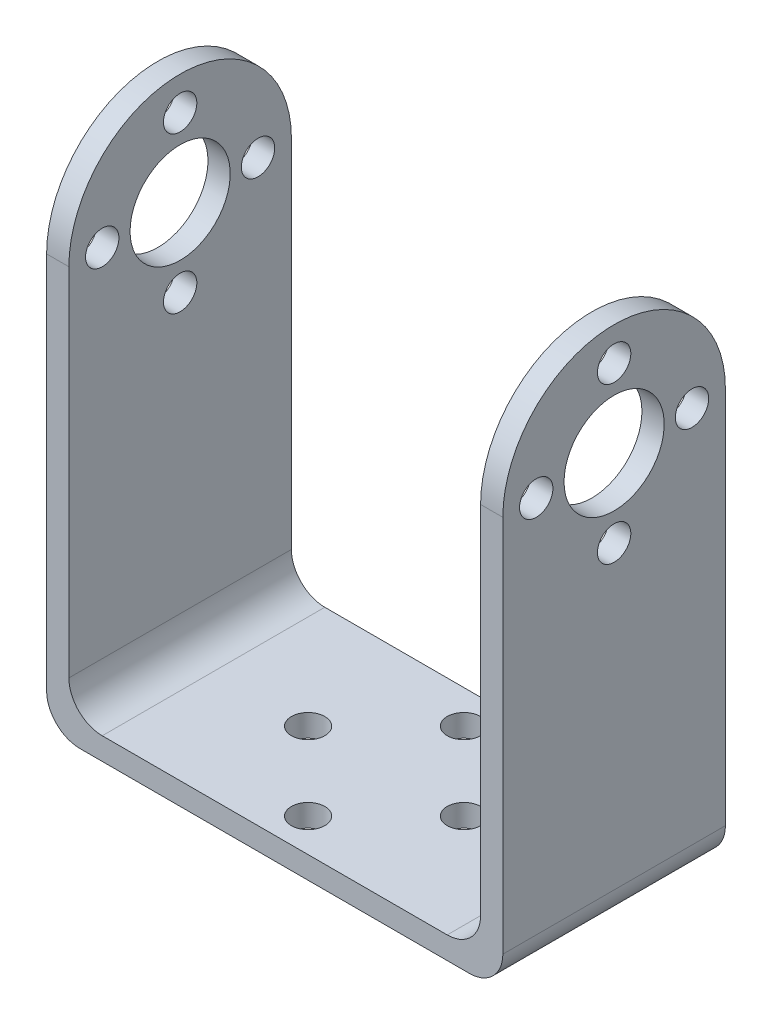
ISO-10303-21;
HEADER;
FILE_DESCRIPTION(('STEP AP214'),'2;1');
FILE_NAME('part.step','',(''),(''),'','','');
FILE_SCHEMA(('AUTOMOTIVE_DESIGN { 1 0 10303 214 1 1 1 1 }'));
ENDSEC;
DATA;
#1=APPLICATION_CONTEXT('core data for automotive mechanical design processes');
#2=APPLICATION_PROTOCOL_DEFINITION('international standard','automotive_design',2000,#1);
#3=PRODUCT_CONTEXT('',#1,'mechanical');
#4=PRODUCT('Part','Part','',(#3));
#5=PRODUCT_RELATED_PRODUCT_CATEGORY('part','',(#4));
#6=PRODUCT_DEFINITION_FORMATION('','',#4);
#7=PRODUCT_DEFINITION_CONTEXT('part definition',#1,'design');
#8=PRODUCT_DEFINITION('design','',#6,#7);
#9=PRODUCT_DEFINITION_SHAPE('','',#8);
#10=(LENGTH_UNIT() NAMED_UNIT(*) SI_UNIT(.MILLI.,.METRE.));
#11=(NAMED_UNIT(*) PLANE_ANGLE_UNIT() SI_UNIT($,.RADIAN.));
#12=(NAMED_UNIT(*) SI_UNIT($,.STERADIAN.) SOLID_ANGLE_UNIT());
#13=UNCERTAINTY_MEASURE_WITH_UNIT(LENGTH_MEASURE(1.E-05),#10,'distance_accuracy_value','');
#14=(GEOMETRIC_REPRESENTATION_CONTEXT(3) GLOBAL_UNCERTAINTY_ASSIGNED_CONTEXT((#13)) GLOBAL_UNIT_ASSIGNED_CONTEXT((#10,
#11,#12)) REPRESENTATION_CONTEXT('',''));
#15=CARTESIAN_POINT('',(0.,0.,0.));
#16=DIRECTION('',(0.,0.,1.));
#17=DIRECTION('',(1.,0.,0.));
#18=AXIS2_PLACEMENT_3D('',#15,#16,#17);
#19=CARTESIAN_POINT('',(-12.5,2.,10.));
#20=DIRECTION('',(0.,0.,-1.));
#21=DIRECTION('',(-1.,0.,0.));
#22=AXIS2_PLACEMENT_3D('',#19,#20,#21);
#23=PLANE('',#22);
#24=DIRECTION('',(-1.,0.,0.));
#25=VECTOR('',#24,1.);
#26=CARTESIAN_POINT('',(20.5,37.,9.99999999999999));
#27=LINE('',#26,#25);
#28=CARTESIAN_POINT('',(-18.5,37.,10.));
#29=VERTEX_POINT('',#28);
#30=CARTESIAN_POINT('',(-20.5,37.,10.));
#31=VERTEX_POINT('',#30);
#32=EDGE_CURVE('E57',#29,#31,#27,.T.);
#33=ORIENTED_EDGE('',*,*,#32,.T.);
#34=DIRECTION('',(0.,-1.,0.));
#35=VECTOR('',#34,1.);
#36=CARTESIAN_POINT('',(-20.5,2.,10.));
#37=LINE('',#36,#35);
#38=CARTESIAN_POINT('',(-20.5,3.,10.));
#39=VERTEX_POINT('',#38);
#40=EDGE_CURVE('E269',#31,#39,#37,.T.);
#41=ORIENTED_EDGE('',*,*,#40,.T.);
#42=CARTESIAN_POINT('',(-17.5,3.,10.));
#43=DIRECTION('',(0.,0.,-1.));
#44=DIRECTION('',(-1.,0.,0.));
#45=AXIS2_PLACEMENT_3D('',#42,#43,#44);
#46=CIRCLE('',#45,3.);
#47=CARTESIAN_POINT('',(-17.5,0.,10.));
#48=VERTEX_POINT('',#47);
#49=EDGE_CURVE('E165',#39,#48,#46,.F.);
#50=ORIENTED_EDGE('',*,*,#49,.T.);
#51=DIRECTION('',(1.,0.,0.));
#52=VECTOR('',#51,1.);
#53=CARTESIAN_POINT('',(-12.5,0.,10.));
#54=LINE('',#53,#52);
#55=CARTESIAN_POINT('',(17.5,0.,10.));
#56=VERTEX_POINT('',#55);
#57=EDGE_CURVE('E265',#48,#56,#54,.T.);
#58=ORIENTED_EDGE('',*,*,#57,.T.);
#59=CARTESIAN_POINT('',(17.5,3.,10.));
#60=DIRECTION('',(0.,0.,-1.));
#61=DIRECTION('',(-1.,0.,0.));
#62=AXIS2_PLACEMENT_3D('',#59,#60,#61);
#63=CIRCLE('',#62,3.);
#64=CARTESIAN_POINT('',(20.5,3.,10.));
#65=VERTEX_POINT('',#64);
#66=EDGE_CURVE('E150',#56,#65,#63,.F.);
#67=ORIENTED_EDGE('',*,*,#66,.T.);
#68=DIRECTION('',(0.,-1.,0.));
#69=VECTOR('',#68,1.);
#70=CARTESIAN_POINT('',(20.5,2.,10.));
#71=LINE('',#70,#69);
#72=CARTESIAN_POINT('',(20.5,37.,9.99999999999999));
#73=VERTEX_POINT('',#72);
#74=EDGE_CURVE('E142',#73,#65,#71,.T.);
#75=ORIENTED_EDGE('',*,*,#74,.F.);
#76=CARTESIAN_POINT('',(18.5,37.,9.99999999999999));
#77=VERTEX_POINT('',#76);
#78=EDGE_CURVE('E128',#73,#77,#27,.T.);
#79=ORIENTED_EDGE('',*,*,#78,.T.);
#80=DIRECTION('',(0.,-1.,0.));
#81=VECTOR('',#80,1.);
#82=CARTESIAN_POINT('',(18.5,62.,10.));
#83=LINE('',#82,#81);
#84=CARTESIAN_POINT('',(18.5,5.,10.));
#85=VERTEX_POINT('',#84);
#86=EDGE_CURVE('E247',#77,#85,#83,.T.);
#87=ORIENTED_EDGE('',*,*,#86,.T.);
#88=CARTESIAN_POINT('',(15.5,5.,10.));
#89=DIRECTION('',(0.,0.,-1.));
#90=DIRECTION('',(-1.,0.,0.));
#91=AXIS2_PLACEMENT_3D('',#88,#89,#90);
#92=CIRCLE('',#91,3.);
#93=CARTESIAN_POINT('',(15.5,2.,10.));
#94=VERTEX_POINT('',#93);
#95=EDGE_CURVE('E205',#85,#94,#92,.T.);
#96=ORIENTED_EDGE('',*,*,#95,.T.);
#97=DIRECTION('',(1.,0.,0.));
#98=VECTOR('',#97,1.);
#99=CARTESIAN_POINT('',(12.5,2.,10.));
#100=LINE('',#99,#98);
#101=CARTESIAN_POINT('',(-15.5,2.,10.));
#102=VERTEX_POINT('',#101);
#103=EDGE_CURVE('E260',#102,#94,#100,.T.);
#104=ORIENTED_EDGE('',*,*,#103,.F.);
#105=CARTESIAN_POINT('',(-15.5,5.,10.));
#106=DIRECTION('',(0.,0.,-1.));
#107=DIRECTION('',(-1.,0.,0.));
#108=AXIS2_PLACEMENT_3D('',#105,#106,#107);
#109=CIRCLE('',#108,3.);
#110=CARTESIAN_POINT('',(-18.5,5.,10.));
#111=VERTEX_POINT('',#110);
#112=EDGE_CURVE('E201',#102,#111,#109,.T.);
#113=ORIENTED_EDGE('',*,*,#112,.T.);
#114=DIRECTION('',(0.,-1.,0.));
#115=VECTOR('',#114,1.);
#116=CARTESIAN_POINT('',(-18.5,62.,10.));
#117=LINE('',#116,#115);
#118=EDGE_CURVE('E256',#29,#111,#117,.T.);
#119=ORIENTED_EDGE('',*,*,#118,.F.);
#120=EDGE_LOOP('',(#33,#41,#50,#58,#67,#75,#79,#87,#96,#104,#113,#119));
#121=FACE_BOUND('',#120,.T.);
#122=ADVANCED_FACE('F39',(#121),#23,.F.);
#123=CARTESIAN_POINT('',(0.,2.,0.));
#124=DIRECTION('',(0.,-1.,0.));
#125=DIRECTION('',(0.,0.,-1.));
#126=AXIS2_PLACEMENT_3D('',#123,#124,#125);
#127=PLANE('',#126);
#128=CARTESIAN_POINT('',(-7.,2.,0.));
#129=DIRECTION('',(0.,-1.,0.));
#130=DIRECTION('',(0.,0.,-1.));
#131=AXIS2_PLACEMENT_3D('',#128,#129,#130);
#132=CIRCLE('',#131,1.5);
#133=CARTESIAN_POINT('',(-7.,2.,-1.5));
#134=VERTEX_POINT('',#133);
#135=EDGE_CURVE('E441',#134,#134,#132,.T.);
#136=ORIENTED_EDGE('',*,*,#135,.T.);
#137=EDGE_LOOP('',(#136));
#138=FACE_BOUND('',#137,.T.);
#139=CARTESIAN_POINT('',(0.,2.,7.));
#140=DIRECTION('',(0.,-1.,0.));
#141=DIRECTION('',(0.,0.,-1.));
#142=AXIS2_PLACEMENT_3D('',#139,#140,#141);
#143=CIRCLE('',#142,1.5);
#144=CARTESIAN_POINT('',(0.,2.,5.5));
#145=VERTEX_POINT('',#144);
#146=EDGE_CURVE('E445',#145,#145,#143,.T.);
#147=ORIENTED_EDGE('',*,*,#146,.T.);
#148=EDGE_LOOP('',(#147));
#149=FACE_BOUND('',#148,.T.);
#150=CARTESIAN_POINT('',(7.,2.,0.));
#151=DIRECTION('',(0.,-1.,0.));
#152=DIRECTION('',(0.,0.,-1.));
#153=AXIS2_PLACEMENT_3D('',#150,#151,#152);
#154=CIRCLE('',#153,1.5);
#155=CARTESIAN_POINT('',(7.,2.,-1.50000000000005));
#156=VERTEX_POINT('',#155);
#157=EDGE_CURVE('E450',#156,#156,#154,.T.);
#158=ORIENTED_EDGE('',*,*,#157,.T.);
#159=EDGE_LOOP('',(#158));
#160=FACE_BOUND('',#159,.T.);
#161=CARTESIAN_POINT('',(0.,2.,-7.));
#162=DIRECTION('',(0.,-1.,0.));
#163=DIRECTION('',(0.,0.,-1.));
#164=AXIS2_PLACEMENT_3D('',#161,#162,#163);
#165=CIRCLE('',#164,1.5);
#166=CARTESIAN_POINT('',(0.,2.,-8.5));
#167=VERTEX_POINT('',#166);
#168=EDGE_CURVE('E510',#167,#167,#165,.T.);
#169=ORIENTED_EDGE('',*,*,#168,.T.);
#170=EDGE_LOOP('',(#169));
#171=FACE_BOUND('',#170,.T.);
#172=DIRECTION('',(-1.,0.,0.));
#173=VECTOR('',#172,1.);
#174=CARTESIAN_POINT('',(12.5,2.,-10.));
#175=LINE('',#174,#173);
#176=CARTESIAN_POINT('',(15.5,2.,-10.));
#177=VERTEX_POINT('',#176);
#178=CARTESIAN_POINT('',(-15.5,2.,-10.));
#179=VERTEX_POINT('',#178);
#180=EDGE_CURVE('E264',#177,#179,#175,.T.);
#181=ORIENTED_EDGE('',*,*,#180,.T.);
#182=DIRECTION('',(0.,0.,-1.));
#183=VECTOR('',#182,1.);
#184=CARTESIAN_POINT('',(-15.5,2.,10.));
#185=LINE('',#184,#183);
#186=EDGE_CURVE('E188',#179,#102,#185,.F.);
#187=ORIENTED_EDGE('',*,*,#186,.T.);
#188=ORIENTED_EDGE('',*,*,#103,.T.);
#189=DIRECTION('',(0.,0.,1.));
#190=VECTOR('',#189,1.);
#191=CARTESIAN_POINT('',(15.5,2.,-10.));
#192=LINE('',#191,#190);
#193=EDGE_CURVE('E185',#94,#177,#192,.F.);
#194=ORIENTED_EDGE('',*,*,#193,.T.);
#195=EDGE_LOOP('',(#181,#187,#188,#194));
#196=FACE_BOUND('',#195,.T.);
#197=ADVANCED_FACE('F334',(#138,#149,#160,#171,#196),#127,.F.);
#198=CARTESIAN_POINT('',(20.5,2.,-10.));
#199=DIRECTION('',(-1.,0.,0.));
#200=DIRECTION('',(0.,0.,1.));
#201=AXIS2_PLACEMENT_3D('',#198,#199,#200);
#202=PLANE('',#201);
#203=CARTESIAN_POINT('',(20.5,37.,7.));
#204=DIRECTION('',(-1.,0.,0.));
#205=DIRECTION('',(0.,0.,1.));
#206=AXIS2_PLACEMENT_3D('',#203,#204,#205);
#207=CIRCLE('',#206,1.5);
#208=CARTESIAN_POINT('',(20.5,37.,8.5));
#209=VERTEX_POINT('',#208);
#210=EDGE_CURVE('E434',#209,#209,#207,.T.);
#211=ORIENTED_EDGE('',*,*,#210,.T.);
#212=EDGE_LOOP('',(#211));
#213=FACE_BOUND('',#212,.T.);
#214=CARTESIAN_POINT('',(20.5,37.,0.));
#215=DIRECTION('',(-1.,0.,0.));
#216=DIRECTION('',(0.,0.,1.));
#217=AXIS2_PLACEMENT_3D('',#214,#215,#216);
#218=CIRCLE('',#217,4.5);
#219=CARTESIAN_POINT('',(20.5,37.,4.5));
#220=VERTEX_POINT('',#219);
#221=EDGE_CURVE('E413',#220,#220,#218,.T.);
#222=ORIENTED_EDGE('',*,*,#221,.T.);
#223=EDGE_LOOP('',(#222));
#224=FACE_BOUND('',#223,.T.);
#225=CARTESIAN_POINT('',(20.5,30.,0.));
#226=DIRECTION('',(-1.,0.,0.));
#227=DIRECTION('',(0.,0.,1.));
#228=AXIS2_PLACEMENT_3D('',#225,#226,#227);
#229=CIRCLE('',#228,1.5);
#230=CARTESIAN_POINT('',(20.5,30.,1.5));
#231=VERTEX_POINT('',#230);
#232=EDGE_CURVE('E420',#231,#231,#229,.T.);
#233=ORIENTED_EDGE('',*,*,#232,.T.);
#234=EDGE_LOOP('',(#233));
#235=FACE_BOUND('',#234,.T.);
#236=CARTESIAN_POINT('',(20.5,37.,-7.));
#237=DIRECTION('',(-1.,0.,0.));
#238=DIRECTION('',(0.,0.,1.));
#239=AXIS2_PLACEMENT_3D('',#236,#237,#238);
#240=CIRCLE('',#239,1.5);
#241=CARTESIAN_POINT('',(20.5,37.,-5.5));
#242=VERTEX_POINT('',#241);
#243=EDGE_CURVE('E433',#242,#242,#240,.T.);
#244=ORIENTED_EDGE('',*,*,#243,.T.);
#245=EDGE_LOOP('',(#244));
#246=FACE_BOUND('',#245,.T.);
#247=CARTESIAN_POINT('',(20.5,44.,0.));
#248=DIRECTION('',(-1.,0.,0.));
#249=DIRECTION('',(0.,0.,1.));
#250=AXIS2_PLACEMENT_3D('',#247,#248,#249);
#251=CIRCLE('',#250,1.5);
#252=CARTESIAN_POINT('',(20.5,44.,1.5));
#253=VERTEX_POINT('',#252);
#254=EDGE_CURVE('E460',#253,#253,#251,.T.);
#255=ORIENTED_EDGE('',*,*,#254,.T.);
#256=EDGE_LOOP('',(#255));
#257=FACE_BOUND('',#256,.T.);
#258=DIRECTION('',(0.,-1.,0.));
#259=VECTOR('',#258,1.);
#260=CARTESIAN_POINT('',(20.5,2.,-10.));
#261=LINE('',#260,#259);
#262=CARTESIAN_POINT('',(20.5,37.,-10.));
#263=VERTEX_POINT('',#262);
#264=CARTESIAN_POINT('',(20.5,3.,-10.));
#265=VERTEX_POINT('',#264);
#266=EDGE_CURVE('E144',#263,#265,#261,.T.);
#267=ORIENTED_EDGE('',*,*,#266,.F.);
#268=CARTESIAN_POINT('',(20.5,37.,0.));
#269=DIRECTION('',(1.,0.,0.));
#270=DIRECTION('',(0.,0.,-1.));
#271=AXIS2_PLACEMENT_3D('',#268,#269,#270);
#272=CIRCLE('',#271,10.);
#273=EDGE_CURVE('E131',#263,#73,#272,.T.);
#274=ORIENTED_EDGE('',*,*,#273,.T.);
#275=ORIENTED_EDGE('',*,*,#74,.T.);
#276=DIRECTION('',(0.,0.,-1.));
#277=VECTOR('',#276,1.);
#278=CARTESIAN_POINT('',(20.5,3.,-10.));
#279=LINE('',#278,#277);
#280=EDGE_CURVE('E195',#65,#265,#279,.T.);
#281=ORIENTED_EDGE('',*,*,#280,.T.);
#282=EDGE_LOOP('',(#267,#274,#275,#281));
#283=FACE_BOUND('',#282,.T.);
#284=ADVANCED_FACE('F140',(#213,#224,#235,#246,#257,#283),#202,.F.);
#285=CARTESIAN_POINT('',(-20.5,2.,-10.));
#286=DIRECTION('',(0.,0.,1.));
#287=DIRECTION('',(1.,0.,0.));
#288=AXIS2_PLACEMENT_3D('',#285,#286,#287);
#289=PLANE('',#288);
#290=DIRECTION('',(0.,-1.,0.));
#291=VECTOR('',#290,1.);
#292=CARTESIAN_POINT('',(-20.5,2.,-10.));
#293=LINE('',#292,#291);
#294=CARTESIAN_POINT('',(-20.5,37.,-10.));
#295=VERTEX_POINT('',#294);
#296=CARTESIAN_POINT('',(-20.5,3.,-10.));
#297=VERTEX_POINT('',#296);
#298=EDGE_CURVE('E159',#295,#297,#293,.T.);
#299=ORIENTED_EDGE('',*,*,#298,.F.);
#300=DIRECTION('',(-1.,0.,0.));
#301=VECTOR('',#300,1.);
#302=CARTESIAN_POINT('',(20.5,37.,-10.));
#303=LINE('',#302,#301);
#304=CARTESIAN_POINT('',(-18.5,37.,-10.));
#305=VERTEX_POINT('',#304);
#306=EDGE_CURVE('E136',#305,#295,#303,.T.);
#307=ORIENTED_EDGE('',*,*,#306,.F.);
#308=DIRECTION('',(0.,-1.,0.));
#309=VECTOR('',#308,1.);
#310=CARTESIAN_POINT('',(-18.5,62.,-10.));
#311=LINE('',#310,#309);
#312=CARTESIAN_POINT('',(-18.5,5.,-10.));
#313=VERTEX_POINT('',#312);
#314=EDGE_CURVE('E253',#305,#313,#311,.T.);
#315=ORIENTED_EDGE('',*,*,#314,.T.);
#316=CARTESIAN_POINT('',(-15.5,5.,-10.));
#317=DIRECTION('',(0.,0.,1.));
#318=DIRECTION('',(1.,0.,0.));
#319=AXIS2_PLACEMENT_3D('',#316,#317,#318);
#320=CIRCLE('',#319,3.);
#321=EDGE_CURVE('E198',#313,#179,#320,.T.);
#322=ORIENTED_EDGE('',*,*,#321,.T.);
#323=ORIENTED_EDGE('',*,*,#180,.F.);
#324=CARTESIAN_POINT('',(15.5,5.,-10.));
#325=DIRECTION('',(0.,0.,1.));
#326=DIRECTION('',(1.,0.,0.));
#327=AXIS2_PLACEMENT_3D('',#324,#325,#326);
#328=CIRCLE('',#327,3.);
#329=CARTESIAN_POINT('',(18.5,5.,-10.));
#330=VERTEX_POINT('',#329);
#331=EDGE_CURVE('E49',#177,#330,#328,.T.);
#332=ORIENTED_EDGE('',*,*,#331,.T.);
#333=DIRECTION('',(0.,-1.,0.));
#334=VECTOR('',#333,1.);
#335=CARTESIAN_POINT('',(18.5,62.,-10.));
#336=LINE('',#335,#334);
#337=CARTESIAN_POINT('',(18.5,37.,-10.));
#338=VERTEX_POINT('',#337);
#339=EDGE_CURVE('E250',#338,#330,#336,.T.);
#340=ORIENTED_EDGE('',*,*,#339,.F.);
#341=EDGE_CURVE('E65',#263,#338,#303,.T.);
#342=ORIENTED_EDGE('',*,*,#341,.F.);
#343=ORIENTED_EDGE('',*,*,#266,.T.);
#344=CARTESIAN_POINT('',(17.5,3.,-10.));
#345=DIRECTION('',(0.,0.,1.));
#346=DIRECTION('',(1.,0.,0.));
#347=AXIS2_PLACEMENT_3D('',#344,#345,#346);
#348=CIRCLE('',#347,3.);
#349=CARTESIAN_POINT('',(17.5,0.,-10.));
#350=VERTEX_POINT('',#349);
#351=EDGE_CURVE('E174',#265,#350,#348,.F.);
#352=ORIENTED_EDGE('',*,*,#351,.T.);
#353=DIRECTION('',(-1.,0.,0.));
#354=VECTOR('',#353,1.);
#355=CARTESIAN_POINT('',(-20.5,0.,-10.));
#356=LINE('',#355,#354);
#357=CARTESIAN_POINT('',(-17.5,0.,-10.));
#358=VERTEX_POINT('',#357);
#359=EDGE_CURVE('E259',#350,#358,#356,.T.);
#360=ORIENTED_EDGE('',*,*,#359,.T.);
#361=CARTESIAN_POINT('',(-17.5,3.,-10.));
#362=DIRECTION('',(0.,0.,1.));
#363=DIRECTION('',(1.,0.,0.));
#364=AXIS2_PLACEMENT_3D('',#361,#362,#363);
#365=CIRCLE('',#364,3.);
#366=EDGE_CURVE('E177',#358,#297,#365,.F.);
#367=ORIENTED_EDGE('',*,*,#366,.T.);
#368=EDGE_LOOP('',(#299,#307,#315,#322,#323,#332,#340,#342,#343,#352,#360,#367));
#369=FACE_BOUND('',#368,.T.);
#370=ADVANCED_FACE('F286',(#369),#289,.F.);
#371=CARTESIAN_POINT('',(-20.5,2.,-10.));
#372=DIRECTION('',(1.,0.,0.));
#373=DIRECTION('',(0.,0.,-1.));
#374=AXIS2_PLACEMENT_3D('',#371,#372,#373);
#375=PLANE('',#374);
#376=CARTESIAN_POINT('',(-20.5,37.,7.00000000000001));
#377=DIRECTION('',(-1.,0.,0.));
#378=DIRECTION('',(0.,0.,1.));
#379=AXIS2_PLACEMENT_3D('',#376,#377,#378);
#380=CIRCLE('',#379,1.5);
#381=CARTESIAN_POINT('',(-20.5,37.,8.50000000000001));
#382=VERTEX_POINT('',#381);
#383=EDGE_CURVE('E438',#382,#382,#380,.T.);
#384=ORIENTED_EDGE('',*,*,#383,.F.);
#385=EDGE_LOOP('',(#384));
#386=FACE_BOUND('',#385,.T.);
#387=CARTESIAN_POINT('',(-20.5,37.,0.));
#388=DIRECTION('',(-1.,0.,0.));
#389=DIRECTION('',(0.,0.,1.));
#390=AXIS2_PLACEMENT_3D('',#387,#388,#389);
#391=CIRCLE('',#390,4.5);
#392=CARTESIAN_POINT('',(-20.5,37.,4.5));
#393=VERTEX_POINT('',#392);
#394=EDGE_CURVE('E416',#393,#393,#391,.T.);
#395=ORIENTED_EDGE('',*,*,#394,.F.);
#396=EDGE_LOOP('',(#395));
#397=FACE_BOUND('',#396,.T.);
#398=CARTESIAN_POINT('',(-20.5,30.,0.));
#399=DIRECTION('',(-1.,0.,0.));
#400=DIRECTION('',(0.,0.,1.));
#401=AXIS2_PLACEMENT_3D('',#398,#399,#400);
#402=CIRCLE('',#401,1.5);
#403=CARTESIAN_POINT('',(-20.5,30.,1.50000000000001));
#404=VERTEX_POINT('',#403);
#405=EDGE_CURVE('E429',#404,#404,#402,.T.);
#406=ORIENTED_EDGE('',*,*,#405,.F.);
#407=EDGE_LOOP('',(#406));
#408=FACE_BOUND('',#407,.T.);
#409=CARTESIAN_POINT('',(-20.5,37.,-7.));
#410=DIRECTION('',(-1.,0.,0.));
#411=DIRECTION('',(0.,0.,1.));
#412=AXIS2_PLACEMENT_3D('',#409,#410,#411);
#413=CIRCLE('',#412,1.5);
#414=CARTESIAN_POINT('',(-20.5,37.,-5.49999999999999));
#415=VERTEX_POINT('',#414);
#416=EDGE_CURVE('E457',#415,#415,#413,.T.);
#417=ORIENTED_EDGE('',*,*,#416,.F.);
#418=EDGE_LOOP('',(#417));
#419=FACE_BOUND('',#418,.T.);
#420=CARTESIAN_POINT('',(-20.5,44.,0.));
#421=DIRECTION('',(-1.,0.,0.));
#422=DIRECTION('',(0.,0.,1.));
#423=AXIS2_PLACEMENT_3D('',#420,#421,#422);
#424=CIRCLE('',#423,1.5);
#425=CARTESIAN_POINT('',(-20.5,44.,1.50000000000001));
#426=VERTEX_POINT('',#425);
#427=EDGE_CURVE('E423',#426,#426,#424,.T.);
#428=ORIENTED_EDGE('',*,*,#427,.F.);
#429=EDGE_LOOP('',(#428));
#430=FACE_BOUND('',#429,.T.);
#431=ORIENTED_EDGE('',*,*,#40,.F.);
#432=CARTESIAN_POINT('',(-20.5,37.,0.));
#433=DIRECTION('',(1.,0.,0.));
#434=DIRECTION('',(0.,0.,-1.));
#435=AXIS2_PLACEMENT_3D('',#432,#433,#434);
#436=CIRCLE('',#435,10.);
#437=EDGE_CURVE('E146',#295,#31,#436,.T.);
#438=ORIENTED_EDGE('',*,*,#437,.F.);
#439=ORIENTED_EDGE('',*,*,#298,.T.);
#440=DIRECTION('',(0.,0.,1.));
#441=VECTOR('',#440,1.);
#442=CARTESIAN_POINT('',(-20.5,3.,10.));
#443=LINE('',#442,#441);
#444=EDGE_CURVE('E153',#297,#39,#443,.T.);
#445=ORIENTED_EDGE('',*,*,#444,.T.);
#446=EDGE_LOOP('',(#431,#438,#439,#445));
#447=FACE_BOUND('',#446,.T.);
#448=ADVANCED_FACE('F281',(#386,#397,#408,#419,#430,#447),#375,.F.);
#449=CARTESIAN_POINT('',(0.,0.,0.));
#450=DIRECTION('',(0.,-1.,0.));
#451=DIRECTION('',(0.,0.,-1.));
#452=AXIS2_PLACEMENT_3D('',#449,#450,#451);
#453=PLANE('',#452);
#454=CARTESIAN_POINT('',(-7.,0.,0.));
#455=DIRECTION('',(0.,-1.,0.));
#456=DIRECTION('',(0.,0.,-1.));
#457=AXIS2_PLACEMENT_3D('',#454,#455,#456);
#458=CIRCLE('',#457,1.5);
#459=CARTESIAN_POINT('',(-7.,0.,-1.5));
#460=VERTEX_POINT('',#459);
#461=EDGE_CURVE('E507',#460,#460,#458,.T.);
#462=ORIENTED_EDGE('',*,*,#461,.F.);
#463=EDGE_LOOP('',(#462));
#464=FACE_BOUND('',#463,.T.);
#465=CARTESIAN_POINT('',(0.,0.,7.));
#466=DIRECTION('',(0.,-1.,0.));
#467=DIRECTION('',(0.,0.,-1.));
#468=AXIS2_PLACEMENT_3D('',#465,#466,#467);
#469=CIRCLE('',#468,1.5);
#470=CARTESIAN_POINT('',(0.,0.,5.5));
#471=VERTEX_POINT('',#470);
#472=EDGE_CURVE('E511',#471,#471,#469,.T.);
#473=ORIENTED_EDGE('',*,*,#472,.F.);
#474=EDGE_LOOP('',(#473));
#475=FACE_BOUND('',#474,.T.);
#476=CARTESIAN_POINT('',(7.,0.,0.));
#477=DIRECTION('',(0.,-1.,0.));
#478=DIRECTION('',(0.,0.,-1.));
#479=AXIS2_PLACEMENT_3D('',#476,#477,#478);
#480=CIRCLE('',#479,1.5);
#481=CARTESIAN_POINT('',(7.,0.,-1.50000000000005));
#482=VERTEX_POINT('',#481);
#483=EDGE_CURVE('E518',#482,#482,#480,.T.);
#484=ORIENTED_EDGE('',*,*,#483,.F.);
#485=EDGE_LOOP('',(#484));
#486=FACE_BOUND('',#485,.T.);
#487=CARTESIAN_POINT('',(0.,0.,-7.));
#488=DIRECTION('',(0.,-1.,0.));
#489=DIRECTION('',(0.,0.,-1.));
#490=AXIS2_PLACEMENT_3D('',#487,#488,#489);
#491=CIRCLE('',#490,1.5);
#492=CARTESIAN_POINT('',(0.,0.,-8.5));
#493=VERTEX_POINT('',#492);
#494=EDGE_CURVE('E524',#493,#493,#491,.T.);
#495=ORIENTED_EDGE('',*,*,#494,.F.);
#496=EDGE_LOOP('',(#495));
#497=FACE_BOUND('',#496,.T.);
#498=ORIENTED_EDGE('',*,*,#57,.F.);
#499=DIRECTION('',(0.,0.,1.));
#500=VECTOR('',#499,1.);
#501=CARTESIAN_POINT('',(-17.5,0.,-10.));
#502=LINE('',#501,#500);
#503=EDGE_CURVE('E171',#48,#358,#502,.F.);
#504=ORIENTED_EDGE('',*,*,#503,.T.);
#505=ORIENTED_EDGE('',*,*,#359,.F.);
#506=DIRECTION('',(0.,0.,-1.));
#507=VECTOR('',#506,1.);
#508=CARTESIAN_POINT('',(17.5,0.,10.));
#509=LINE('',#508,#507);
#510=EDGE_CURVE('E168',#350,#56,#509,.F.);
#511=ORIENTED_EDGE('',*,*,#510,.T.);
#512=EDGE_LOOP('',(#498,#504,#505,#511));
#513=FACE_BOUND('',#512,.T.);
#514=ADVANCED_FACE('F294',(#464,#475,#486,#497,#513),#453,.T.);
#515=CARTESIAN_POINT('',(-18.5,62.,-10.));
#516=DIRECTION('',(-1.,0.,0.));
#517=DIRECTION('',(0.,0.,1.));
#518=AXIS2_PLACEMENT_3D('',#515,#516,#517);
#519=PLANE('',#518);
#520=CARTESIAN_POINT('',(-18.5,37.,7.00000000000001));
#521=DIRECTION('',(-1.,0.,0.));
#522=DIRECTION('',(0.,0.,1.));
#523=AXIS2_PLACEMENT_3D('',#520,#521,#522);
#524=CIRCLE('',#523,1.5);
#525=CARTESIAN_POINT('',(-18.5,37.,8.50000000000001));
#526=VERTEX_POINT('',#525);
#527=EDGE_CURVE('E243',#526,#526,#524,.T.);
#528=ORIENTED_EDGE('',*,*,#527,.T.);
#529=EDGE_LOOP('',(#528));
#530=FACE_BOUND('',#529,.T.);
#531=CARTESIAN_POINT('',(-18.5,37.,0.));
#532=DIRECTION('',(-1.,0.,0.));
#533=DIRECTION('',(0.,0.,1.));
#534=AXIS2_PLACEMENT_3D('',#531,#532,#533);
#535=CIRCLE('',#534,4.5);
#536=CARTESIAN_POINT('',(-18.5,37.,4.5));
#537=VERTEX_POINT('',#536);
#538=EDGE_CURVE('E229',#537,#537,#535,.T.);
#539=ORIENTED_EDGE('',*,*,#538,.T.);
#540=EDGE_LOOP('',(#539));
#541=FACE_BOUND('',#540,.T.);
#542=CARTESIAN_POINT('',(-18.5,30.,0.));
#543=DIRECTION('',(-1.,0.,0.));
#544=DIRECTION('',(0.,0.,1.));
#545=AXIS2_PLACEMENT_3D('',#542,#543,#544);
#546=CIRCLE('',#545,1.5);
#547=CARTESIAN_POINT('',(-18.5,30.,1.50000000000001));
#548=VERTEX_POINT('',#547);
#549=EDGE_CURVE('E225',#548,#548,#546,.T.);
#550=ORIENTED_EDGE('',*,*,#549,.T.);
#551=EDGE_LOOP('',(#550));
#552=FACE_BOUND('',#551,.T.);
#553=CARTESIAN_POINT('',(-18.5,37.,-7.));
#554=DIRECTION('',(-1.,0.,0.));
#555=DIRECTION('',(0.,0.,1.));
#556=AXIS2_PLACEMENT_3D('',#553,#554,#555);
#557=CIRCLE('',#556,1.5);
#558=CARTESIAN_POINT('',(-18.5,37.,-5.49999999999999));
#559=VERTEX_POINT('',#558);
#560=EDGE_CURVE('E221',#559,#559,#557,.T.);
#561=ORIENTED_EDGE('',*,*,#560,.T.);
#562=EDGE_LOOP('',(#561));
#563=FACE_BOUND('',#562,.T.);
#564=CARTESIAN_POINT('',(-18.5,44.,0.));
#565=DIRECTION('',(-1.,0.,0.));
#566=DIRECTION('',(0.,0.,1.));
#567=AXIS2_PLACEMENT_3D('',#564,#565,#566);
#568=CIRCLE('',#567,1.5);
#569=CARTESIAN_POINT('',(-18.5,44.,1.50000000000001));
#570=VERTEX_POINT('',#569);
#571=EDGE_CURVE('E215',#570,#570,#568,.T.);
#572=ORIENTED_EDGE('',*,*,#571,.T.);
#573=EDGE_LOOP('',(#572));
#574=FACE_BOUND('',#573,.T.);
#575=ORIENTED_EDGE('',*,*,#314,.F.);
#576=CARTESIAN_POINT('',(-18.5,37.,0.));
#577=DIRECTION('',(-1.,0.,0.));
#578=DIRECTION('',(0.,0.,1.));
#579=AXIS2_PLACEMENT_3D('',#576,#577,#578);
#580=CIRCLE('',#579,10.);
#581=EDGE_CURVE('E216',#305,#29,#580,.F.);
#582=ORIENTED_EDGE('',*,*,#581,.T.);
#583=ORIENTED_EDGE('',*,*,#118,.T.);
#584=DIRECTION('',(0.,0.,-1.));
#585=VECTOR('',#584,1.);
#586=CARTESIAN_POINT('',(-18.5,5.,-10.));
#587=LINE('',#586,#585);
#588=EDGE_CURVE('E181',#111,#313,#587,.T.);
#589=ORIENTED_EDGE('',*,*,#588,.T.);
#590=EDGE_LOOP('',(#575,#582,#583,#589));
#591=FACE_BOUND('',#590,.T.);
#592=ADVANCED_FACE('F309',(#530,#541,#552,#563,#574,#591),#519,.F.);
#593=CARTESIAN_POINT('',(18.5,62.,-10.));
#594=DIRECTION('',(1.,0.,0.));
#595=DIRECTION('',(0.,0.,-1.));
#596=AXIS2_PLACEMENT_3D('',#593,#594,#595);
#597=PLANE('',#596);
#598=CARTESIAN_POINT('',(18.5,37.,7.));
#599=DIRECTION('',(1.,0.,0.));
#600=DIRECTION('',(0.,0.,-1.));
#601=AXIS2_PLACEMENT_3D('',#598,#599,#600);
#602=CIRCLE('',#601,1.5);
#603=CARTESIAN_POINT('',(18.5,37.,5.5));
#604=VERTEX_POINT('',#603);
#605=EDGE_CURVE('E43',#604,#604,#602,.T.);
#606=ORIENTED_EDGE('',*,*,#605,.T.);
#607=EDGE_LOOP('',(#606));
#608=FACE_BOUND('',#607,.T.);
#609=CARTESIAN_POINT('',(18.5,37.,0.));
#610=DIRECTION('',(1.,0.,0.));
#611=DIRECTION('',(0.,0.,-1.));
#612=AXIS2_PLACEMENT_3D('',#609,#610,#611);
#613=CIRCLE('',#612,4.5);
#614=CARTESIAN_POINT('',(18.5,37.,-4.5));
#615=VERTEX_POINT('',#614);
#616=EDGE_CURVE('E226',#615,#615,#613,.T.);
#617=ORIENTED_EDGE('',*,*,#616,.T.);
#618=EDGE_LOOP('',(#617));
#619=FACE_BOUND('',#618,.T.);
#620=CARTESIAN_POINT('',(18.5,30.,0.));
#621=DIRECTION('',(1.,0.,0.));
#622=DIRECTION('',(0.,0.,-1.));
#623=AXIS2_PLACEMENT_3D('',#620,#621,#622);
#624=CIRCLE('',#623,1.5);
#625=CARTESIAN_POINT('',(18.5,30.,-1.5));
#626=VERTEX_POINT('',#625);
#627=EDGE_CURVE('E222',#626,#626,#624,.T.);
#628=ORIENTED_EDGE('',*,*,#627,.T.);
#629=EDGE_LOOP('',(#628));
#630=FACE_BOUND('',#629,.T.);
#631=CARTESIAN_POINT('',(18.5,37.,-7.));
#632=DIRECTION('',(1.,0.,0.));
#633=DIRECTION('',(0.,0.,-1.));
#634=AXIS2_PLACEMENT_3D('',#631,#632,#633);
#635=CIRCLE('',#634,1.5);
#636=CARTESIAN_POINT('',(18.5,37.,-8.5));
#637=VERTEX_POINT('',#636);
#638=EDGE_CURVE('E217',#637,#637,#635,.T.);
#639=ORIENTED_EDGE('',*,*,#638,.T.);
#640=EDGE_LOOP('',(#639));
#641=FACE_BOUND('',#640,.T.);
#642=CARTESIAN_POINT('',(18.5,44.,0.));
#643=DIRECTION('',(1.,0.,0.));
#644=DIRECTION('',(0.,0.,-1.));
#645=AXIS2_PLACEMENT_3D('',#642,#643,#644);
#646=CIRCLE('',#645,1.5);
#647=CARTESIAN_POINT('',(18.5,44.,-1.5));
#648=VERTEX_POINT('',#647);
#649=EDGE_CURVE('E211',#648,#648,#646,.T.);
#650=ORIENTED_EDGE('',*,*,#649,.T.);
#651=EDGE_LOOP('',(#650));
#652=FACE_BOUND('',#651,.T.);
#653=ORIENTED_EDGE('',*,*,#86,.F.);
#654=CARTESIAN_POINT('',(18.5,37.,0.));
#655=DIRECTION('',(1.,0.,0.));
#656=DIRECTION('',(0.,0.,-1.));
#657=AXIS2_PLACEMENT_3D('',#654,#655,#656);
#658=CIRCLE('',#657,10.);
#659=EDGE_CURVE('E11',#77,#338,#658,.F.);
#660=ORIENTED_EDGE('',*,*,#659,.T.);
#661=ORIENTED_EDGE('',*,*,#339,.T.);
#662=DIRECTION('',(0.,0.,1.));
#663=VECTOR('',#662,1.);
#664=CARTESIAN_POINT('',(18.5,5.,10.));
#665=LINE('',#664,#663);
#666=EDGE_CURVE('E191',#330,#85,#665,.T.);
#667=ORIENTED_EDGE('',*,*,#666,.T.);
#668=EDGE_LOOP('',(#653,#660,#661,#667));
#669=FACE_BOUND('',#668,.T.);
#670=ADVANCED_FACE('F354',(#608,#619,#630,#641,#652,#669),#597,.F.);
#671=CARTESIAN_POINT('',(-17.5,3.,-10.));
#672=DIRECTION('',(0.,0.,-1.));
#673=DIRECTION('',(-1.,0.,0.));
#674=AXIS2_PLACEMENT_3D('',#671,#672,#673);
#675=CYLINDRICAL_SURFACE('',#674,3.);
#676=ORIENTED_EDGE('',*,*,#366,.F.);
#677=ORIENTED_EDGE('',*,*,#503,.F.);
#678=ORIENTED_EDGE('',*,*,#49,.F.);
#679=ORIENTED_EDGE('',*,*,#444,.F.);
#680=EDGE_LOOP('',(#676,#677,#678,#679));
#681=FACE_BOUND('',#680,.T.);
#682=ADVANCED_FACE('F291',(#681),#675,.T.);
#683=CARTESIAN_POINT('',(-15.5,5.,-10.));
#684=DIRECTION('',(0.,0.,1.));
#685=DIRECTION('',(1.,0.,0.));
#686=AXIS2_PLACEMENT_3D('',#683,#684,#685);
#687=CYLINDRICAL_SURFACE('',#686,3.);
#688=ORIENTED_EDGE('',*,*,#112,.F.);
#689=ORIENTED_EDGE('',*,*,#186,.F.);
#690=ORIENTED_EDGE('',*,*,#321,.F.);
#691=ORIENTED_EDGE('',*,*,#588,.F.);
#692=EDGE_LOOP('',(#688,#689,#690,#691));
#693=FACE_BOUND('',#692,.T.);
#694=ADVANCED_FACE('F353',(#693),#687,.F.);
#695=CARTESIAN_POINT('',(15.5,5.,-10.));
#696=DIRECTION('',(0.,0.,-1.));
#697=DIRECTION('',(-1.,0.,0.));
#698=AXIS2_PLACEMENT_3D('',#695,#696,#697);
#699=CYLINDRICAL_SURFACE('',#698,3.);
#700=ORIENTED_EDGE('',*,*,#331,.F.);
#701=ORIENTED_EDGE('',*,*,#193,.F.);
#702=ORIENTED_EDGE('',*,*,#95,.F.);
#703=ORIENTED_EDGE('',*,*,#666,.F.);
#704=EDGE_LOOP('',(#700,#701,#702,#703));
#705=FACE_BOUND('',#704,.T.);
#706=ADVANCED_FACE('F356',(#705),#699,.F.);
#707=CARTESIAN_POINT('',(17.5,3.,-10.));
#708=DIRECTION('',(0.,0.,1.));
#709=DIRECTION('',(1.,0.,0.));
#710=AXIS2_PLACEMENT_3D('',#707,#708,#709);
#711=CYLINDRICAL_SURFACE('',#710,3.);
#712=ORIENTED_EDGE('',*,*,#66,.F.);
#713=ORIENTED_EDGE('',*,*,#510,.F.);
#714=ORIENTED_EDGE('',*,*,#351,.F.);
#715=ORIENTED_EDGE('',*,*,#280,.F.);
#716=EDGE_LOOP('',(#712,#713,#714,#715));
#717=FACE_BOUND('',#716,.T.);
#718=ADVANCED_FACE('F41',(#717),#711,.T.);
#719=CARTESIAN_POINT('',(20.5,37.,0.));
#720=DIRECTION('',(-1.,0.,0.));
#721=DIRECTION('',(0.,0.,1.));
#722=AXIS2_PLACEMENT_3D('',#719,#720,#721);
#723=CYLINDRICAL_SURFACE('',#722,10.);
#724=ORIENTED_EDGE('',*,*,#78,.F.);
#725=ORIENTED_EDGE('',*,*,#273,.F.);
#726=ORIENTED_EDGE('',*,*,#341,.T.);
#727=ORIENTED_EDGE('',*,*,#659,.F.);
#728=EDGE_LOOP('',(#724,#725,#726,#727));
#729=FACE_BOUND('',#728,.T.);
#730=ADVANCED_FACE('F130',(#729),#723,.T.);
#731=CARTESIAN_POINT('',(20.5,44.,0.));
#732=DIRECTION('',(-1.,0.,0.));
#733=DIRECTION('',(0.,0.,1.));
#734=AXIS2_PLACEMENT_3D('',#731,#732,#733);
#735=CYLINDRICAL_SURFACE('',#734,1.5);
#736=ORIENTED_EDGE('',*,*,#254,.F.);
#737=EDGE_LOOP('',(#736));
#738=FACE_BOUND('',#737,.T.);
#739=ORIENTED_EDGE('',*,*,#649,.F.);
#740=EDGE_LOOP('',(#739));
#741=FACE_BOUND('',#740,.T.);
#742=ADVANCED_FACE('F318',(#738,#741),#735,.F.);
#743=CARTESIAN_POINT('',(20.5,37.,-7.));
#744=DIRECTION('',(-1.,0.,0.));
#745=DIRECTION('',(0.,0.,1.));
#746=AXIS2_PLACEMENT_3D('',#743,#744,#745);
#747=CYLINDRICAL_SURFACE('',#746,1.5);
#748=ORIENTED_EDGE('',*,*,#243,.F.);
#749=EDGE_LOOP('',(#748));
#750=FACE_BOUND('',#749,.T.);
#751=ORIENTED_EDGE('',*,*,#638,.F.);
#752=EDGE_LOOP('',(#751));
#753=FACE_BOUND('',#752,.T.);
#754=ADVANCED_FACE('F326',(#750,#753),#747,.F.);
#755=CARTESIAN_POINT('',(20.5,30.,0.));
#756=DIRECTION('',(-1.,0.,0.));
#757=DIRECTION('',(0.,0.,1.));
#758=AXIS2_PLACEMENT_3D('',#755,#756,#757);
#759=CYLINDRICAL_SURFACE('',#758,1.5);
#760=ORIENTED_EDGE('',*,*,#232,.F.);
#761=EDGE_LOOP('',(#760));
#762=FACE_BOUND('',#761,.T.);
#763=ORIENTED_EDGE('',*,*,#627,.F.);
#764=EDGE_LOOP('',(#763));
#765=FACE_BOUND('',#764,.T.);
#766=ADVANCED_FACE('F394',(#762,#765),#759,.F.);
#767=CARTESIAN_POINT('',(20.5,37.,0.));
#768=DIRECTION('',(-1.,0.,0.));
#769=DIRECTION('',(0.,0.,1.));
#770=AXIS2_PLACEMENT_3D('',#767,#768,#769);
#771=CYLINDRICAL_SURFACE('',#770,4.5);
#772=ORIENTED_EDGE('',*,*,#221,.F.);
#773=EDGE_LOOP('',(#772));
#774=FACE_BOUND('',#773,.T.);
#775=ORIENTED_EDGE('',*,*,#616,.F.);
#776=EDGE_LOOP('',(#775));
#777=FACE_BOUND('',#776,.T.);
#778=ADVANCED_FACE('F397',(#774,#777),#771,.F.);
#779=CARTESIAN_POINT('',(20.5,37.,7.));
#780=DIRECTION('',(-1.,0.,0.));
#781=DIRECTION('',(0.,0.,1.));
#782=AXIS2_PLACEMENT_3D('',#779,#780,#781);
#783=CYLINDRICAL_SURFACE('',#782,1.5);
#784=ORIENTED_EDGE('',*,*,#210,.F.);
#785=EDGE_LOOP('',(#784));
#786=FACE_BOUND('',#785,.T.);
#787=ORIENTED_EDGE('',*,*,#605,.F.);
#788=EDGE_LOOP('',(#787));
#789=FACE_BOUND('',#788,.T.);
#790=ADVANCED_FACE('F327',(#786,#789),#783,.F.);
#791=ORIENTED_EDGE('',*,*,#306,.T.);
#792=ORIENTED_EDGE('',*,*,#437,.T.);
#793=ORIENTED_EDGE('',*,*,#32,.F.);
#794=ORIENTED_EDGE('',*,*,#581,.F.);
#795=EDGE_LOOP('',(#791,#792,#793,#794));
#796=FACE_BOUND('',#795,.T.);
#797=ADVANCED_FACE('F315',(#796),#723,.T.);
#798=ORIENTED_EDGE('',*,*,#427,.T.);
#799=EDGE_LOOP('',(#798));
#800=FACE_BOUND('',#799,.T.);
#801=ORIENTED_EDGE('',*,*,#571,.F.);
#802=EDGE_LOOP('',(#801));
#803=FACE_BOUND('',#802,.T.);
#804=ADVANCED_FACE('F312',(#800,#803),#735,.F.);
#805=ORIENTED_EDGE('',*,*,#416,.T.);
#806=EDGE_LOOP('',(#805));
#807=FACE_BOUND('',#806,.T.);
#808=ORIENTED_EDGE('',*,*,#560,.F.);
#809=EDGE_LOOP('',(#808));
#810=FACE_BOUND('',#809,.T.);
#811=ADVANCED_FACE('F314',(#807,#810),#747,.F.);
#812=ORIENTED_EDGE('',*,*,#405,.T.);
#813=EDGE_LOOP('',(#812));
#814=FACE_BOUND('',#813,.T.);
#815=ORIENTED_EDGE('',*,*,#549,.F.);
#816=EDGE_LOOP('',(#815));
#817=FACE_BOUND('',#816,.T.);
#818=ADVANCED_FACE('F323',(#814,#817),#759,.F.);
#819=ORIENTED_EDGE('',*,*,#394,.T.);
#820=EDGE_LOOP('',(#819));
#821=FACE_BOUND('',#820,.T.);
#822=ORIENTED_EDGE('',*,*,#538,.F.);
#823=EDGE_LOOP('',(#822));
#824=FACE_BOUND('',#823,.T.);
#825=ADVANCED_FACE('F390',(#821,#824),#771,.F.);
#826=ORIENTED_EDGE('',*,*,#383,.T.);
#827=EDGE_LOOP('',(#826));
#828=FACE_BOUND('',#827,.T.);
#829=ORIENTED_EDGE('',*,*,#527,.F.);
#830=EDGE_LOOP('',(#829));
#831=FACE_BOUND('',#830,.T.);
#832=ADVANCED_FACE('F386',(#828,#831),#783,.F.);
#833=CARTESIAN_POINT('',(0.,10.,-7.));
#834=DIRECTION('',(0.,-1.,0.));
#835=DIRECTION('',(0.,0.,-1.));
#836=AXIS2_PLACEMENT_3D('',#833,#834,#835);
#837=CYLINDRICAL_SURFACE('',#836,1.5);
#838=ORIENTED_EDGE('',*,*,#494,.T.);
#839=EDGE_LOOP('',(#838));
#840=FACE_BOUND('',#839,.T.);
#841=ORIENTED_EDGE('',*,*,#168,.F.);
#842=EDGE_LOOP('',(#841));
#843=FACE_BOUND('',#842,.T.);
#844=ADVANCED_FACE('F389',(#840,#843),#837,.F.);
#845=CARTESIAN_POINT('',(7.,10.,0.));
#846=DIRECTION('',(0.,-1.,0.));
#847=DIRECTION('',(0.,0.,-1.));
#848=AXIS2_PLACEMENT_3D('',#845,#846,#847);
#849=CYLINDRICAL_SURFACE('',#848,1.5);
#850=ORIENTED_EDGE('',*,*,#483,.T.);
#851=EDGE_LOOP('',(#850));
#852=FACE_BOUND('',#851,.T.);
#853=ORIENTED_EDGE('',*,*,#157,.F.);
#854=EDGE_LOOP('',(#853));
#855=FACE_BOUND('',#854,.T.);
#856=ADVANCED_FACE('F490',(#852,#855),#849,.F.);
#857=CARTESIAN_POINT('',(0.,10.,7.));
#858=DIRECTION('',(0.,-1.,0.));
#859=DIRECTION('',(0.,0.,-1.));
#860=AXIS2_PLACEMENT_3D('',#857,#858,#859);
#861=CYLINDRICAL_SURFACE('',#860,1.5);
#862=ORIENTED_EDGE('',*,*,#472,.T.);
#863=EDGE_LOOP('',(#862));
#864=FACE_BOUND('',#863,.T.);
#865=ORIENTED_EDGE('',*,*,#146,.F.);
#866=EDGE_LOOP('',(#865));
#867=FACE_BOUND('',#866,.T.);
#868=ADVANCED_FACE('F494',(#864,#867),#861,.F.);
#869=CARTESIAN_POINT('',(-7.,10.,0.));
#870=DIRECTION('',(0.,-1.,0.));
#871=DIRECTION('',(0.,0.,-1.));
#872=AXIS2_PLACEMENT_3D('',#869,#870,#871);
#873=CYLINDRICAL_SURFACE('',#872,1.5);
#874=ORIENTED_EDGE('',*,*,#461,.T.);
#875=EDGE_LOOP('',(#874));
#876=FACE_BOUND('',#875,.T.);
#877=ORIENTED_EDGE('',*,*,#135,.F.);
#878=EDGE_LOOP('',(#877));
#879=FACE_BOUND('',#878,.T.);
#880=ADVANCED_FACE('F498',(#876,#879),#873,.F.);
#881=CLOSED_SHELL('',(#122,#197,#284,#370,#448,#514,#592,#670,#682,#694,#706,#718,#730,#742,
#754,#766,#778,#790,#797,#804,#811,#818,#825,#832,#844,#856,#868,#880));
#882=MANIFOLD_SOLID_BREP('B2',#881);
#883=ADVANCED_BREP_SHAPE_REPRESENTATION('',(#18,#882),#14);
#884=SHAPE_DEFINITION_REPRESENTATION(#9,#883);
ENDSEC;
END-ISO-10303-21;
